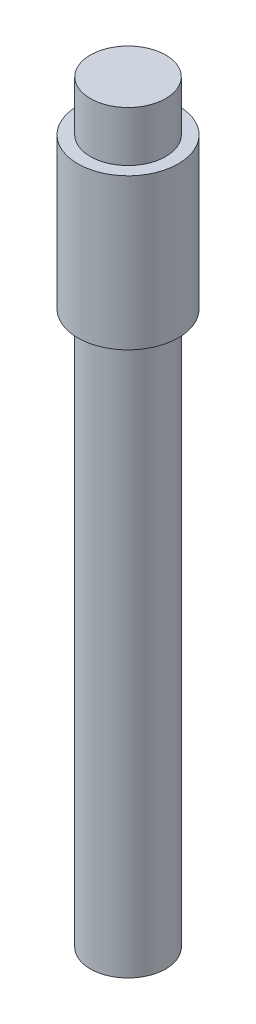
ISO-10303-21;
HEADER;
FILE_DESCRIPTION(('STEP AP214'),'2;1');
FILE_NAME('part.step','',(''),(''),'','','');
FILE_SCHEMA(('AUTOMOTIVE_DESIGN { 1 0 10303 214 1 1 1 1 }'));
ENDSEC;
DATA;
#1=APPLICATION_CONTEXT('core data for automotive mechanical design processes');
#2=APPLICATION_PROTOCOL_DEFINITION('international standard','automotive_design',2000,#1);
#3=PRODUCT_CONTEXT('',#1,'mechanical');
#4=PRODUCT('Part','Part','',(#3));
#5=PRODUCT_RELATED_PRODUCT_CATEGORY('part','',(#4));
#6=PRODUCT_DEFINITION_FORMATION('','',#4);
#7=PRODUCT_DEFINITION_CONTEXT('part definition',#1,'design');
#8=PRODUCT_DEFINITION('design','',#6,#7);
#9=PRODUCT_DEFINITION_SHAPE('','',#8);
#10=(LENGTH_UNIT() NAMED_UNIT(*) SI_UNIT(.MILLI.,.METRE.));
#11=(NAMED_UNIT(*) PLANE_ANGLE_UNIT() SI_UNIT($,.RADIAN.));
#12=(NAMED_UNIT(*) SI_UNIT($,.STERADIAN.) SOLID_ANGLE_UNIT());
#13=UNCERTAINTY_MEASURE_WITH_UNIT(LENGTH_MEASURE(1.E-05),#10,'distance_accuracy_value','');
#14=(GEOMETRIC_REPRESENTATION_CONTEXT(3) GLOBAL_UNCERTAINTY_ASSIGNED_CONTEXT((#13)) GLOBAL_UNIT_ASSIGNED_CONTEXT((#10,
#11,#12)) REPRESENTATION_CONTEXT('',''));
#15=CARTESIAN_POINT('',(0.,0.,0.));
#16=DIRECTION('',(0.,0.,1.));
#17=DIRECTION('',(1.,0.,0.));
#18=AXIS2_PLACEMENT_3D('',#15,#16,#17);
#19=CARTESIAN_POINT('',(-7.50000000000003,65.,0.));
#20=DIRECTION('',(0.,-1.,0.));
#21=DIRECTION('',(1.,0.,0.));
#22=AXIS2_PLACEMENT_3D('',#19,#20,#21);
#23=PLANE('',#22);
#24=CARTESIAN_POINT('',(0.,65.,0.));
#25=DIRECTION('',(0.,-1.,0.));
#26=DIRECTION('',(1.,0.,0.));
#27=AXIS2_PLACEMENT_3D('',#24,#25,#26);
#28=CIRCLE('',#27,9.99999999999998);
#29=CARTESIAN_POINT('',(9.99999999999995,65.,0.));
#30=VERTEX_POINT('',#29);
#31=EDGE_CURVE('E10',#30,#30,#28,.T.);
#32=ORIENTED_EDGE('',*,*,#31,.F.);
#33=EDGE_LOOP('',(#32));
#34=FACE_BOUND('',#33,.T.);
#35=CARTESIAN_POINT('',(0.,65.,0.));
#36=DIRECTION('',(0.,-1.,0.));
#37=DIRECTION('',(1.,0.,0.));
#38=AXIS2_PLACEMENT_3D('',#35,#36,#37);
#39=CIRCLE('',#38,7.5);
#40=CARTESIAN_POINT('',(7.49999999999997,65.,0.));
#41=VERTEX_POINT('',#40);
#42=EDGE_CURVE('E53',#41,#41,#39,.T.);
#43=ORIENTED_EDGE('',*,*,#42,.T.);
#44=EDGE_LOOP('',(#43));
#45=FACE_BOUND('',#44,.T.);
#46=ADVANCED_FACE('F31',(#34,#45),#23,.F.);
#47=CARTESIAN_POINT('',(0.,-75.,0.));
#48=DIRECTION('',(0.,-1.,0.));
#49=DIRECTION('',(1.,0.,0.));
#50=AXIS2_PLACEMENT_3D('',#47,#48,#49);
#51=CYLINDRICAL_SURFACE('',#50,9.99999999999998);
#52=CARTESIAN_POINT('',(0.,35.,0.));
#53=DIRECTION('',(0.,-1.,0.));
#54=DIRECTION('',(1.,0.,0.));
#55=AXIS2_PLACEMENT_3D('',#52,#53,#54);
#56=CIRCLE('',#55,9.99999999999998);
#57=CARTESIAN_POINT('',(9.99999999999996,35.,0.));
#58=VERTEX_POINT('',#57);
#59=EDGE_CURVE('E37',#58,#58,#56,.T.);
#60=ORIENTED_EDGE('',*,*,#59,.F.);
#61=EDGE_LOOP('',(#60));
#62=FACE_BOUND('',#61,.T.);
#63=ORIENTED_EDGE('',*,*,#31,.T.);
#64=EDGE_LOOP('',(#63));
#65=FACE_BOUND('',#64,.T.);
#66=ADVANCED_FACE('F87',(#62,#65),#51,.T.);
#67=CARTESIAN_POINT('',(-10.,35.,0.));
#68=DIRECTION('',(0.,1.,0.));
#69=DIRECTION('',(-1.,0.,0.));
#70=AXIS2_PLACEMENT_3D('',#67,#68,#69);
#71=PLANE('',#70);
#72=CARTESIAN_POINT('',(0.,35.,0.));
#73=DIRECTION('',(0.,-1.,0.));
#74=DIRECTION('',(1.,0.,0.));
#75=AXIS2_PLACEMENT_3D('',#72,#73,#74);
#76=CIRCLE('',#75,7.5);
#77=CARTESIAN_POINT('',(7.49999999999998,35.,0.));
#78=VERTEX_POINT('',#77);
#79=EDGE_CURVE('E41',#78,#78,#76,.T.);
#80=ORIENTED_EDGE('',*,*,#79,.F.);
#81=EDGE_LOOP('',(#80));
#82=FACE_BOUND('',#81,.T.);
#83=ORIENTED_EDGE('',*,*,#59,.T.);
#84=EDGE_LOOP('',(#83));
#85=FACE_BOUND('',#84,.T.);
#86=ADVANCED_FACE('F82',(#82,#85),#71,.F.);
#87=CARTESIAN_POINT('',(0.,-75.,0.));
#88=DIRECTION('',(0.,-1.,0.));
#89=DIRECTION('',(1.,0.,0.));
#90=AXIS2_PLACEMENT_3D('',#87,#88,#89);
#91=CYLINDRICAL_SURFACE('',#90,7.5);
#92=CARTESIAN_POINT('',(0.,-75.,0.));
#93=DIRECTION('',(0.,-1.,0.));
#94=DIRECTION('',(1.,0.,0.));
#95=AXIS2_PLACEMENT_3D('',#92,#93,#94);
#96=CIRCLE('',#95,7.5);
#97=CARTESIAN_POINT('',(7.5,-75.,0.));
#98=VERTEX_POINT('',#97);
#99=EDGE_CURVE('E45',#98,#98,#96,.T.);
#100=ORIENTED_EDGE('',*,*,#99,.F.);
#101=EDGE_LOOP('',(#100));
#102=FACE_BOUND('',#101,.T.);
#103=ORIENTED_EDGE('',*,*,#79,.T.);
#104=EDGE_LOOP('',(#103));
#105=FACE_BOUND('',#104,.T.);
#106=ADVANCED_FACE('F76',(#102,#105),#91,.T.);
#107=CARTESIAN_POINT('',(-7.5,-75.,0.));
#108=DIRECTION('',(0.,1.,0.));
#109=DIRECTION('',(-1.,0.,0.));
#110=AXIS2_PLACEMENT_3D('',#107,#108,#109);
#111=PLANE('',#110);
#112=CARTESIAN_POINT('',(0.,-75.,0.));
#113=DIRECTION('',(0.,-1.,0.));
#114=DIRECTION('',(1.,0.,0.));
#115=AXIS2_PLACEMENT_3D('',#112,#113,#114);
#116=CIRCLE('',#115,4.1);
#117=CARTESIAN_POINT('',(4.10000000000001,-75.,0.));
#118=VERTEX_POINT('',#117);
#119=EDGE_CURVE('E57',#118,#118,#116,.T.);
#120=ORIENTED_EDGE('',*,*,#119,.F.);
#121=EDGE_LOOP('',(#120));
#122=FACE_BOUND('',#121,.T.);
#123=ORIENTED_EDGE('',*,*,#99,.T.);
#124=EDGE_LOOP('',(#123));
#125=FACE_BOUND('',#124,.T.);
#126=ADVANCED_FACE('F72',(#122,#125),#111,.F.);
#127=CARTESIAN_POINT('',(0.,75.,0.));
#128=DIRECTION('',(0.,-1.,0.));
#129=DIRECTION('',(1.,0.,0.));
#130=AXIS2_PLACEMENT_3D('',#127,#128,#129);
#131=PLANE('',#130);
#132=CARTESIAN_POINT('',(0.,75.,0.));
#133=DIRECTION('',(0.,-1.,0.));
#134=DIRECTION('',(1.,0.,0.));
#135=AXIS2_PLACEMENT_3D('',#132,#133,#134);
#136=CIRCLE('',#135,7.5);
#137=CARTESIAN_POINT('',(7.49999999999997,75.,0.));
#138=VERTEX_POINT('',#137);
#139=EDGE_CURVE('E50',#138,#138,#136,.T.);
#140=ORIENTED_EDGE('',*,*,#139,.F.);
#141=EDGE_LOOP('',(#140));
#142=FACE_BOUND('',#141,.T.);
#143=ADVANCED_FACE('F75',(#142),#131,.F.);
#144=CARTESIAN_POINT('',(0.,-75.,0.));
#145=DIRECTION('',(0.,-1.,0.));
#146=DIRECTION('',(1.,0.,0.));
#147=AXIS2_PLACEMENT_3D('',#144,#145,#146);
#148=CYLINDRICAL_SURFACE('',#147,7.5);
#149=ORIENTED_EDGE('',*,*,#42,.F.);
#150=EDGE_LOOP('',(#149));
#151=FACE_BOUND('',#150,.T.);
#152=ORIENTED_EDGE('',*,*,#139,.T.);
#153=EDGE_LOOP('',(#152));
#154=FACE_BOUND('',#153,.T.);
#155=ADVANCED_FACE('F68',(#151,#154),#148,.T.);
#156=CARTESIAN_POINT('',(0.,-25.,0.));
#157=DIRECTION('',(0.,-1.,0.));
#158=DIRECTION('',(1.,0.,0.));
#159=AXIS2_PLACEMENT_3D('',#156,#157,#158);
#160=CYLINDRICAL_SURFACE('',#159,4.1);
#161=CARTESIAN_POINT('',(0.,-25.,0.));
#162=DIRECTION('',(0.,-1.,0.));
#163=DIRECTION('',(1.,0.,0.));
#164=AXIS2_PLACEMENT_3D('',#161,#162,#163);
#165=CIRCLE('',#164,4.1);
#166=CARTESIAN_POINT('',(4.1,-25.,0.));
#167=VERTEX_POINT('',#166);
#168=EDGE_CURVE('E56',#167,#167,#165,.T.);
#169=ORIENTED_EDGE('',*,*,#168,.F.);
#170=EDGE_LOOP('',(#169));
#171=FACE_BOUND('',#170,.T.);
#172=ORIENTED_EDGE('',*,*,#119,.T.);
#173=EDGE_LOOP('',(#172));
#174=FACE_BOUND('',#173,.T.);
#175=ADVANCED_FACE('F65',(#171,#174),#160,.F.);
#176=CARTESIAN_POINT('',(0.,-25.,0.));
#177=DIRECTION('',(0.,-1.,0.));
#178=DIRECTION('',(1.,0.,0.));
#179=AXIS2_PLACEMENT_3D('',#176,#177,#178);
#180=PLANE('',#179);
#181=ORIENTED_EDGE('',*,*,#168,.T.);
#182=EDGE_LOOP('',(#181));
#183=FACE_BOUND('',#182,.T.);
#184=ADVANCED_FACE('F63',(#183),#180,.T.);
#185=CLOSED_SHELL('',(#46,#66,#86,#106,#126,#143,#155,#175,#184));
#186=MANIFOLD_SOLID_BREP('B2',#185);
#187=ADVANCED_BREP_SHAPE_REPRESENTATION('',(#18,#186),#14);
#188=SHAPE_DEFINITION_REPRESENTATION(#9,#187);
ENDSEC;
END-ISO-10303-21;
